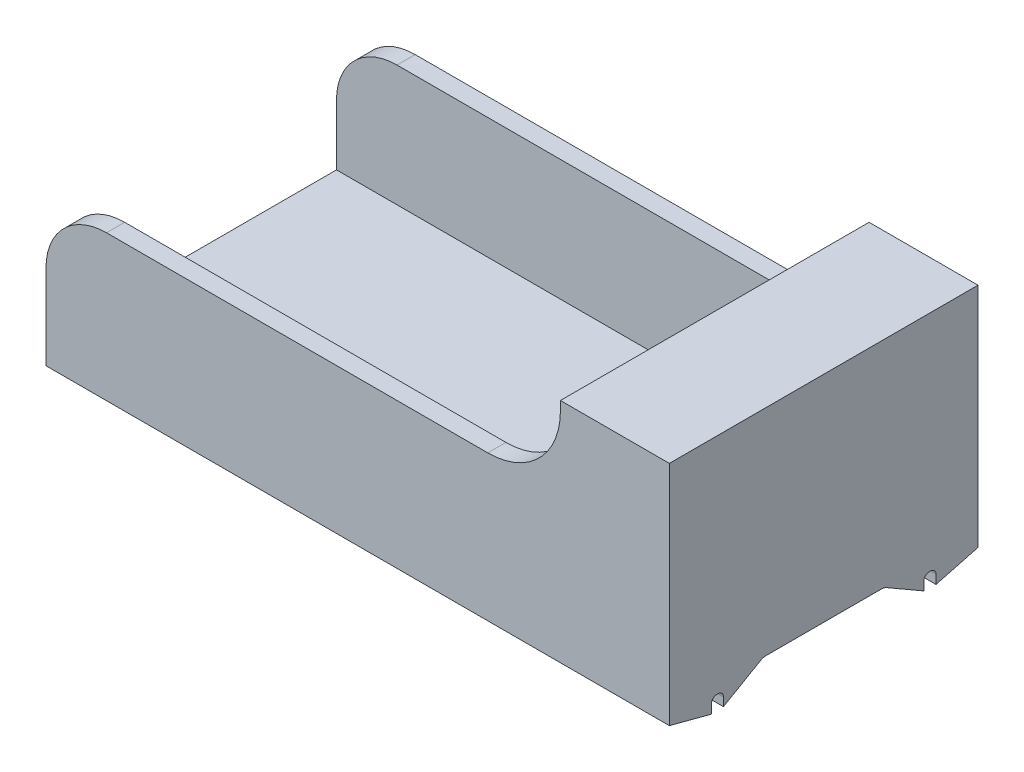
ISO-10303-21;
HEADER;
FILE_DESCRIPTION(('STEP AP214'),'2;1');
FILE_NAME('part.step','',(''),(''),'','','');
FILE_SCHEMA(('AUTOMOTIVE_DESIGN { 1 0 10303 214 1 1 1 1 }'));
ENDSEC;
DATA;
#1=APPLICATION_CONTEXT('core data for automotive mechanical design processes');
#2=APPLICATION_PROTOCOL_DEFINITION('international standard','automotive_design',2000,#1);
#3=PRODUCT_CONTEXT('',#1,'mechanical');
#4=PRODUCT('Part','Part','',(#3));
#5=PRODUCT_RELATED_PRODUCT_CATEGORY('part','',(#4));
#6=PRODUCT_DEFINITION_FORMATION('','',#4);
#7=PRODUCT_DEFINITION_CONTEXT('part definition',#1,'design');
#8=PRODUCT_DEFINITION('design','',#6,#7);
#9=PRODUCT_DEFINITION_SHAPE('','',#8);
#10=(LENGTH_UNIT() NAMED_UNIT(*) SI_UNIT(.MILLI.,.METRE.));
#11=(NAMED_UNIT(*) PLANE_ANGLE_UNIT() SI_UNIT($,.RADIAN.));
#12=(NAMED_UNIT(*) SI_UNIT($,.STERADIAN.) SOLID_ANGLE_UNIT());
#13=UNCERTAINTY_MEASURE_WITH_UNIT(LENGTH_MEASURE(1.E-05),#10,'distance_accuracy_value','');
#14=(GEOMETRIC_REPRESENTATION_CONTEXT(3) GLOBAL_UNCERTAINTY_ASSIGNED_CONTEXT((#13)) GLOBAL_UNIT_ASSIGNED_CONTEXT((#10,
#11,#12)) REPRESENTATION_CONTEXT('',''));
#15=CARTESIAN_POINT('',(0.,0.,0.));
#16=DIRECTION('',(0.,0.,1.));
#17=DIRECTION('',(1.,0.,0.));
#18=AXIS2_PLACEMENT_3D('',#15,#16,#17);
#19=CARTESIAN_POINT('',(0.,0.,0.));
#20=DIRECTION('',(0.,-1.,0.));
#21=DIRECTION('',(0.,0.,-1.));
#22=AXIS2_PLACEMENT_3D('',#19,#20,#21);
#23=PLANE('',#22);
#24=DIRECTION('',(0.,0.,1.));
#25=VECTOR('',#24,1.);
#26=CARTESIAN_POINT('',(0.,0.,0.));
#27=LINE('',#26,#25);
#28=CARTESIAN_POINT('',(0.,0.,-31.9641016151377));
#29=VERTEX_POINT('',#28);
#30=CARTESIAN_POINT('',(0.,0.,-13.0358983848622));
#31=VERTEX_POINT('',#30);
#32=EDGE_CURVE('E493',#29,#31,#27,.T.);
#33=ORIENTED_EDGE('',*,*,#32,.F.);
#34=DIRECTION('',(1.,0.,0.));
#35=VECTOR('',#34,1.);
#36=CARTESIAN_POINT('',(-10.,0.,-31.9641016151378));
#37=LINE('',#36,#35);
#38=CARTESIAN_POINT('',(103.,0.,-31.9641016151378));
#39=VERTEX_POINT('',#38);
#40=EDGE_CURVE('E386',#39,#29,#37,.F.);
#41=ORIENTED_EDGE('',*,*,#40,.F.);
#42=DIRECTION('',(0.,0.,1.));
#43=VECTOR('',#42,1.);
#44=CARTESIAN_POINT('',(103.,0.,-48.));
#45=LINE('',#44,#43);
#46=CARTESIAN_POINT('',(103.,0.,-13.0358983848623));
#47=VERTEX_POINT('',#46);
#48=EDGE_CURVE('E432',#39,#47,#45,.T.);
#49=ORIENTED_EDGE('',*,*,#48,.T.);
#50=DIRECTION('',(1.,0.,0.));
#51=VECTOR('',#50,1.);
#52=CARTESIAN_POINT('',(-10.,0.,-13.0358983848622));
#53=LINE('',#52,#51);
#54=EDGE_CURVE('E390',#31,#47,#53,.T.);
#55=ORIENTED_EDGE('',*,*,#54,.F.);
#56=EDGE_LOOP('',(#33,#41,#49,#55));
#57=FACE_BOUND('',#56,.T.);
#58=ADVANCED_FACE('F47',(#57),#23,.T.);
#59=CARTESIAN_POINT('',(100.,22.,-45.));
#60=DIRECTION('',(0.,1.,0.));
#61=DIRECTION('',(0.,0.,1.));
#62=AXIS2_PLACEMENT_3D('',#59,#60,#61);
#63=PLANE('',#62);
#64=DIRECTION('',(-1.,0.,0.));
#65=VECTOR('',#64,1.);
#66=CARTESIAN_POINT('',(100.,22.,-48.));
#67=LINE('',#66,#65);
#68=CARTESIAN_POINT('',(73.,22.,-48.));
#69=VERTEX_POINT('',#68);
#70=CARTESIAN_POINT('',(9.99999999999998,22.,-48.));
#71=VERTEX_POINT('',#70);
#72=EDGE_CURVE('E465',#69,#71,#67,.T.);
#73=ORIENTED_EDGE('',*,*,#72,.T.);
#74=DIRECTION('',(0.,0.,-1.));
#75=VECTOR('',#74,1.);
#76=CARTESIAN_POINT('',(9.99999999999999,22.,-45.));
#77=LINE('',#76,#75);
#78=CARTESIAN_POINT('',(9.99999999999998,22.,-45.));
#79=VERTEX_POINT('',#78);
#80=EDGE_CURVE('E607',#71,#79,#77,.F.);
#81=ORIENTED_EDGE('',*,*,#80,.T.);
#82=DIRECTION('',(-1.,0.,0.));
#83=VECTOR('',#82,1.);
#84=CARTESIAN_POINT('',(100.,22.,-45.));
#85=LINE('',#84,#83);
#86=CARTESIAN_POINT('',(73.,22.,-45.));
#87=VERTEX_POINT('',#86);
#88=EDGE_CURVE('E496',#87,#79,#85,.T.);
#89=ORIENTED_EDGE('',*,*,#88,.F.);
#90=DIRECTION('',(0.,0.,-1.));
#91=VECTOR('',#90,1.);
#92=CARTESIAN_POINT('',(73.,22.,-45.));
#93=LINE('',#92,#91);
#94=EDGE_CURVE('E570',#87,#69,#93,.T.);
#95=ORIENTED_EDGE('',*,*,#94,.T.);
#96=EDGE_LOOP('',(#73,#81,#89,#95));
#97=FACE_BOUND('',#96,.T.);
#98=ADVANCED_FACE('F630',(#97),#63,.T.);
#99=CARTESIAN_POINT('',(100.,22.,0.));
#100=DIRECTION('',(0.,1.,0.));
#101=DIRECTION('',(0.,0.,1.));
#102=AXIS2_PLACEMENT_3D('',#99,#100,#101);
#103=PLANE('',#102);
#104=DIRECTION('',(-1.,0.,0.));
#105=VECTOR('',#104,1.);
#106=CARTESIAN_POINT('',(100.,22.,0.));
#107=LINE('',#106,#105);
#108=CARTESIAN_POINT('',(73.,22.,0.));
#109=VERTEX_POINT('',#108);
#110=CARTESIAN_POINT('',(9.99999999999999,22.,0.));
#111=VERTEX_POINT('',#110);
#112=EDGE_CURVE('E490',#109,#111,#107,.T.);
#113=ORIENTED_EDGE('',*,*,#112,.T.);
#114=DIRECTION('',(0.,0.,-1.));
#115=VECTOR('',#114,1.);
#116=CARTESIAN_POINT('',(10.,22.,3.));
#117=LINE('',#116,#115);
#118=CARTESIAN_POINT('',(10.,22.,3.));
#119=VERTEX_POINT('',#118);
#120=EDGE_CURVE('E56',#111,#119,#117,.F.);
#121=ORIENTED_EDGE('',*,*,#120,.T.);
#122=DIRECTION('',(-1.,0.,0.));
#123=VECTOR('',#122,1.);
#124=CARTESIAN_POINT('',(100.,22.,2.99999999999997));
#125=LINE('',#124,#123);
#126=CARTESIAN_POINT('',(73.,22.,2.99999999999998));
#127=VERTEX_POINT('',#126);
#128=EDGE_CURVE('E481',#127,#119,#125,.T.);
#129=ORIENTED_EDGE('',*,*,#128,.F.);
#130=DIRECTION('',(0.,0.,-1.));
#131=VECTOR('',#130,1.);
#132=CARTESIAN_POINT('',(73.,22.,0.));
#133=LINE('',#132,#131);
#134=EDGE_CURVE('E580',#127,#109,#133,.T.);
#135=ORIENTED_EDGE('',*,*,#134,.T.);
#136=EDGE_LOOP('',(#113,#121,#129,#135));
#137=FACE_BOUND('',#136,.T.);
#138=ADVANCED_FACE('F722',(#137),#103,.T.);
#139=CARTESIAN_POINT('',(0.,2.,0.));
#140=DIRECTION('',(1.,0.,0.));
#141=DIRECTION('',(0.,0.,-1.));
#142=AXIS2_PLACEMENT_3D('',#139,#140,#141);
#143=PLANE('',#142);
#144=DIRECTION('',(0.,1.,0.));
#145=VECTOR('',#144,1.);
#146=CARTESIAN_POINT('',(0.,2.,-45.));
#147=LINE('',#146,#145);
#148=CARTESIAN_POINT('',(0.,2.,-45.));
#149=VERTEX_POINT('',#148);
#150=CARTESIAN_POINT('',(0.,12.,-45.));
#151=VERTEX_POINT('',#150);
#152=EDGE_CURVE('E487',#149,#151,#147,.T.);
#153=ORIENTED_EDGE('',*,*,#152,.T.);
#154=DIRECTION('',(0.,0.,-1.));
#155=VECTOR('',#154,1.);
#156=CARTESIAN_POINT('',(0.,12.,-48.));
#157=LINE('',#156,#155);
#158=CARTESIAN_POINT('',(0.,12.,-48.));
#159=VERTEX_POINT('',#158);
#160=EDGE_CURVE('E600',#151,#159,#157,.T.);
#161=ORIENTED_EDGE('',*,*,#160,.T.);
#162=DIRECTION('',(0.,-1.,0.));
#163=VECTOR('',#162,1.);
#164=CARTESIAN_POINT('',(0.,22.,-48.));
#165=LINE('',#164,#163);
#166=CARTESIAN_POINT('',(0.,-2.03421701422188,-48.));
#167=VERTEX_POINT('',#166);
#168=EDGE_CURVE('E504',#159,#167,#165,.T.);
#169=ORIENTED_EDGE('',*,*,#168,.T.);
#170=DIRECTION('',(0.,-0.254493299279644,0.967074537262646));
#171=VECTOR('',#170,1.);
#172=CARTESIAN_POINT('',(0.,-2.69275218169454,-45.4975663636038));
#173=LINE('',#172,#171);
#174=CARTESIAN_POINT('',(0.,-3.8604605341743,-41.0602746241807));
#175=VERTEX_POINT('',#174);
#176=EDGE_CURVE('E412',#167,#175,#173,.T.);
#177=ORIENTED_EDGE('',*,*,#176,.T.);
#178=DIRECTION('',(0.,-1.,0.));
#179=VECTOR('',#178,1.);
#180=CARTESIAN_POINT('',(0.,-3.8604605341743,-41.0602746241807));
#181=LINE('',#180,#179);
#182=CARTESIAN_POINT('',(0.,-2.38757632022863,-41.0602746241807));
#183=VERTEX_POINT('',#182);
#184=EDGE_CURVE('E276',#183,#175,#181,.T.);
#185=ORIENTED_EDGE('',*,*,#184,.F.);
#186=CARTESIAN_POINT('',(0.,-2.38757632022863,-40.1602746241807));
#187=DIRECTION('',(-1.,0.,0.));
#188=DIRECTION('',(0.,0.,-1.));
#189=AXIS2_PLACEMENT_3D('',#186,#187,#188);
#190=CIRCLE('',#189,0.899999999999999);
#191=CARTESIAN_POINT('',(0.,-1.48757632022863,-40.1602746241807));
#192=VERTEX_POINT('',#191);
#193=EDGE_CURVE('E296',#192,#183,#190,.T.);
#194=ORIENTED_EDGE('',*,*,#193,.F.);
#195=DIRECTION('',(0.,0.,-1.));
#196=VECTOR('',#195,1.);
#197=CARTESIAN_POINT('',(0.,-1.48757632022863,-39.9602746241807));
#198=LINE('',#197,#196);
#199=CARTESIAN_POINT('',(0.,-1.48757632022863,-39.9602746241807));
#200=VERTEX_POINT('',#199);
#201=EDGE_CURVE('E292',#200,#192,#198,.T.);
#202=ORIENTED_EDGE('',*,*,#201,.F.);
#203=CARTESIAN_POINT('',(0.,-2.38757632022863,-39.9602746241807));
#204=DIRECTION('',(-1.,0.,0.));
#205=DIRECTION('',(0.,0.,-1.));
#206=AXIS2_PLACEMENT_3D('',#203,#204,#205);
#207=CIRCLE('',#206,0.899999999999999);
#208=CARTESIAN_POINT('',(0.,-2.38757632022863,-39.0602746241807));
#209=VERTEX_POINT('',#208);
#210=EDGE_CURVE('E268',#209,#200,#207,.T.);
#211=ORIENTED_EDGE('',*,*,#210,.F.);
#212=DIRECTION('',(0.,1.,0.));
#213=VECTOR('',#212,1.);
#214=CARTESIAN_POINT('',(0.,-3.78757632022863,-39.0602746241807));
#215=LINE('',#214,#213);
#216=CARTESIAN_POINT('',(0.,-3.78757632022864,-39.0602746241807));
#217=VERTEX_POINT('',#216);
#218=EDGE_CURVE('E279',#217,#209,#215,.T.);
#219=ORIENTED_EDGE('',*,*,#218,.F.);
#220=DIRECTION('',(0.,-0.500000000000002,-0.866025403784438));
#221=VECTOR('',#220,1.);
#222=CARTESIAN_POINT('',(0.,-9.76219687932943,-49.4086209884888));
#223=LINE('',#222,#221);
#224=CARTESIAN_POINT('',(0.,-0.267949192431118,-32.9641016151378));
#225=VERTEX_POINT('',#224);
#226=EDGE_CURVE('E402',#225,#217,#223,.T.);
#227=ORIENTED_EDGE('',*,*,#226,.F.);
#228=CARTESIAN_POINT('',(0.,-1.99999999999999,-31.9641016151378));
#229=DIRECTION('',(1.,0.,0.));
#230=DIRECTION('',(0.,0.,-1.));
#231=AXIS2_PLACEMENT_3D('',#228,#229,#230);
#232=CIRCLE('',#231,2.);
#233=EDGE_CURVE('E416',#225,#29,#232,.T.);
#234=ORIENTED_EDGE('',*,*,#233,.T.);
#235=ORIENTED_EDGE('',*,*,#32,.T.);
#236=CARTESIAN_POINT('',(0.,-1.99999999999999,-13.0358983848622));
#237=DIRECTION('',(1.,0.,0.));
#238=DIRECTION('',(0.,0.,-1.));
#239=AXIS2_PLACEMENT_3D('',#236,#237,#238);
#240=CIRCLE('',#239,2.);
#241=CARTESIAN_POINT('',(0.,-0.267949192431113,-12.0358983848622));
#242=VERTEX_POINT('',#241);
#243=EDGE_CURVE('E408',#31,#242,#240,.T.);
#244=ORIENTED_EDGE('',*,*,#243,.T.);
#245=DIRECTION('',(0.,0.500000000000002,-0.866025403784438));
#246=VECTOR('',#245,1.);
#247=CARTESIAN_POINT('',(0.,12.3214509171738,-33.8413790115111));
#248=LINE('',#247,#246);
#249=CARTESIAN_POINT('',(0.,-3.78757632022865,-5.93972537581922));
#250=VERTEX_POINT('',#249);
#251=EDGE_CURVE('E407',#250,#242,#248,.T.);
#252=ORIENTED_EDGE('',*,*,#251,.F.);
#253=DIRECTION('',(0.,-1.,0.));
#254=VECTOR('',#253,1.);
#255=CARTESIAN_POINT('',(0.,-3.78757632022864,-5.93972537581922));
#256=LINE('',#255,#254);
#257=CARTESIAN_POINT('',(0.,-2.38757632022864,-5.93972537581922));
#258=VERTEX_POINT('',#257);
#259=EDGE_CURVE('E316',#258,#250,#256,.T.);
#260=ORIENTED_EDGE('',*,*,#259,.F.);
#261=CARTESIAN_POINT('',(0.,-2.38757632022864,-5.03972537581922));
#262=DIRECTION('',(-1.,0.,0.));
#263=DIRECTION('',(0.,0.,1.));
#264=AXIS2_PLACEMENT_3D('',#261,#262,#263);
#265=CIRCLE('',#264,0.9);
#266=CARTESIAN_POINT('',(0.,-1.48757632022864,-5.03972537581922));
#267=VERTEX_POINT('',#266);
#268=EDGE_CURVE('E328',#267,#258,#265,.T.);
#269=ORIENTED_EDGE('',*,*,#268,.F.);
#270=DIRECTION('',(0.,0.,-1.));
#271=VECTOR('',#270,1.);
#272=CARTESIAN_POINT('',(0.,-1.48757632022864,-5.03972537581922));
#273=LINE('',#272,#271);
#274=CARTESIAN_POINT('',(0.,-1.48757632022864,-4.83972537581922));
#275=VERTEX_POINT('',#274);
#276=EDGE_CURVE('E332',#275,#267,#273,.T.);
#277=ORIENTED_EDGE('',*,*,#276,.F.);
#278=CARTESIAN_POINT('',(0.,-2.38757632022864,-4.83972537581922));
#279=DIRECTION('',(-1.,0.,0.));
#280=DIRECTION('',(0.,0.,1.));
#281=AXIS2_PLACEMENT_3D('',#278,#279,#280);
#282=CIRCLE('',#281,0.9);
#283=CARTESIAN_POINT('',(0.,-2.38757632022864,-3.93972537581922));
#284=VERTEX_POINT('',#283);
#285=EDGE_CURVE('E336',#284,#275,#282,.T.);
#286=ORIENTED_EDGE('',*,*,#285,.F.);
#287=DIRECTION('',(0.,1.,0.));
#288=VECTOR('',#287,1.);
#289=CARTESIAN_POINT('',(0.,-2.38757632022864,-3.93972537581922));
#290=LINE('',#289,#288);
#291=CARTESIAN_POINT('',(0.,-3.86046053417434,-3.93972537581922));
#292=VERTEX_POINT('',#291);
#293=EDGE_CURVE('E286',#292,#284,#290,.T.);
#294=ORIENTED_EDGE('',*,*,#293,.F.);
#295=DIRECTION('',(0.,-0.254493299279644,-0.967074537262646));
#296=VECTOR('',#295,1.);
#297=CARTESIAN_POINT('',(0.,-15.2445656531972,-47.199324828106));
#298=LINE('',#297,#296);
#299=CARTESIAN_POINT('',(0.,-2.03421701422193,3.));
#300=VERTEX_POINT('',#299);
#301=EDGE_CURVE('E403',#300,#292,#298,.T.);
#302=ORIENTED_EDGE('',*,*,#301,.F.);
#303=DIRECTION('',(0.,1.,0.));
#304=VECTOR('',#303,1.);
#305=CARTESIAN_POINT('',(0.,22.,3.));
#306=LINE('',#305,#304);
#307=CARTESIAN_POINT('',(0.,12.,3.));
#308=VERTEX_POINT('',#307);
#309=EDGE_CURVE('E483',#300,#308,#306,.T.);
#310=ORIENTED_EDGE('',*,*,#309,.T.);
#311=DIRECTION('',(0.,0.,-1.));
#312=VECTOR('',#311,1.);
#313=CARTESIAN_POINT('',(0.,12.,0.));
#314=LINE('',#313,#312);
#315=CARTESIAN_POINT('',(0.,12.,0.));
#316=VERTEX_POINT('',#315);
#317=EDGE_CURVE('E596',#308,#316,#314,.T.);
#318=ORIENTED_EDGE('',*,*,#317,.T.);
#319=DIRECTION('',(0.,-1.,0.));
#320=VECTOR('',#319,1.);
#321=CARTESIAN_POINT('',(0.,2.,0.));
#322=LINE('',#321,#320);
#323=CARTESIAN_POINT('',(0.,2.,0.));
#324=VERTEX_POINT('',#323);
#325=EDGE_CURVE('E482',#316,#324,#322,.T.);
#326=ORIENTED_EDGE('',*,*,#325,.T.);
#327=DIRECTION('',(0.,0.,1.));
#328=VECTOR('',#327,1.);
#329=CARTESIAN_POINT('',(0.,2.,0.));
#330=LINE('',#329,#328);
#331=EDGE_CURVE('E524',#149,#324,#330,.T.);
#332=ORIENTED_EDGE('',*,*,#331,.F.);
#333=EDGE_LOOP('',(#153,#161,#169,#177,#185,#194,#202,#211,#219,#227,#234,#235,#244,#252,#260,
#269,#277,#286,#294,#302,#310,#318,#326,#332));
#334=FACE_BOUND('',#333,.T.);
#335=ADVANCED_FACE('F289',(#334),#143,.F.);
#336=CARTESIAN_POINT('',(0.,2.,0.));
#337=DIRECTION('',(0.,-1.,0.));
#338=DIRECTION('',(0.,0.,-1.));
#339=AXIS2_PLACEMENT_3D('',#336,#337,#338);
#340=PLANE('',#339);
#341=DIRECTION('',(1.,0.,0.));
#342=VECTOR('',#341,1.);
#343=CARTESIAN_POINT('',(100.,2.,0.));
#344=LINE('',#343,#342);
#345=CARTESIAN_POINT('',(100.,2.,0.));
#346=VERTEX_POINT('',#345);
#347=EDGE_CURVE('E512',#324,#346,#344,.T.);
#348=ORIENTED_EDGE('',*,*,#347,.T.);
#349=DIRECTION('',(0.,0.,-1.));
#350=VECTOR('',#349,1.);
#351=CARTESIAN_POINT('',(100.,2.,-45.));
#352=LINE('',#351,#350);
#353=CARTESIAN_POINT('',(100.,2.,-45.));
#354=VERTEX_POINT('',#353);
#355=EDGE_CURVE('E516',#346,#354,#352,.T.);
#356=ORIENTED_EDGE('',*,*,#355,.T.);
#357=DIRECTION('',(-1.,0.,0.));
#358=VECTOR('',#357,1.);
#359=CARTESIAN_POINT('',(0.,2.,-45.));
#360=LINE('',#359,#358);
#361=EDGE_CURVE('E520',#354,#149,#360,.T.);
#362=ORIENTED_EDGE('',*,*,#361,.T.);
#363=ORIENTED_EDGE('',*,*,#331,.T.);
#364=EDGE_LOOP('',(#348,#356,#362,#363));
#365=FACE_BOUND('',#364,.T.);
#366=ADVANCED_FACE('F742',(#365),#340,.F.);
#367=CARTESIAN_POINT('',(100.,2.,-45.));
#368=DIRECTION('',(0.,0.,1.));
#369=DIRECTION('',(1.,0.,0.));
#370=AXIS2_PLACEMENT_3D('',#367,#368,#369);
#371=PLANE('',#370);
#372=ORIENTED_EDGE('',*,*,#88,.T.);
#373=CARTESIAN_POINT('',(9.99999999999999,12.,-45.));
#374=DIRECTION('',(0.,0.,1.));
#375=DIRECTION('',(1.,0.,0.));
#376=AXIS2_PLACEMENT_3D('',#373,#374,#375);
#377=CIRCLE('',#376,10.);
#378=EDGE_CURVE('E610',#79,#151,#377,.T.);
#379=ORIENTED_EDGE('',*,*,#378,.T.);
#380=ORIENTED_EDGE('',*,*,#152,.F.);
#381=ORIENTED_EDGE('',*,*,#361,.F.);
#382=DIRECTION('',(0.,1.,0.));
#383=VECTOR('',#382,1.);
#384=CARTESIAN_POINT('',(100.,0.,-45.));
#385=LINE('',#384,#383);
#386=CARTESIAN_POINT('',(100.,32.5,-45.));
#387=VERTEX_POINT('',#386);
#388=EDGE_CURVE('E500',#354,#387,#385,.T.);
#389=ORIENTED_EDGE('',*,*,#388,.T.);
#390=DIRECTION('',(1.,0.,0.));
#391=VECTOR('',#390,1.);
#392=CARTESIAN_POINT('',(85.,32.5,-45.));
#393=LINE('',#392,#391);
#394=CARTESIAN_POINT('',(87.,32.5,-45.));
#395=VERTEX_POINT('',#394);
#396=EDGE_CURVE('E470',#395,#387,#393,.T.);
#397=ORIENTED_EDGE('',*,*,#396,.F.);
#398=DIRECTION('',(-0.707106781186543,0.707106781186552,0.));
#399=VECTOR('',#398,1.);
#400=CARTESIAN_POINT('',(87.,32.5,-45.));
#401=LINE('',#400,#399);
#402=CARTESIAN_POINT('',(85.,34.5,-45.));
#403=VERTEX_POINT('',#402);
#404=EDGE_CURVE('E539',#395,#403,#401,.T.);
#405=ORIENTED_EDGE('',*,*,#404,.T.);
#406=DIRECTION('',(0.,-1.,0.));
#407=VECTOR('',#406,1.);
#408=CARTESIAN_POINT('',(85.,22.,-45.));
#409=LINE('',#408,#407);
#410=CARTESIAN_POINT('',(85.,34.,-45.));
#411=VERTEX_POINT('',#410);
#412=EDGE_CURVE('E443',#403,#411,#409,.T.);
#413=ORIENTED_EDGE('',*,*,#412,.T.);
#414=CARTESIAN_POINT('',(73.,34.,-45.));
#415=DIRECTION('',(0.,0.,1.));
#416=DIRECTION('',(1.,0.,0.));
#417=AXIS2_PLACEMENT_3D('',#414,#415,#416);
#418=CIRCLE('',#417,12.);
#419=EDGE_CURVE('E587',#411,#87,#418,.F.);
#420=ORIENTED_EDGE('',*,*,#419,.T.);
#421=EDGE_LOOP('',(#372,#379,#380,#381,#389,#397,#405,#413,#420));
#422=FACE_BOUND('',#421,.T.);
#423=ADVANCED_FACE('F617',(#422),#371,.T.);
#424=CARTESIAN_POINT('',(100.,22.,-48.));
#425=DIRECTION('',(0.,0.,-1.));
#426=DIRECTION('',(-1.,0.,0.));
#427=AXIS2_PLACEMENT_3D('',#424,#425,#426);
#428=PLANE('',#427);
#429=ORIENTED_EDGE('',*,*,#168,.F.);
#430=CARTESIAN_POINT('',(9.99999999999998,12.,-48.));
#431=DIRECTION('',(0.,0.,-1.));
#432=DIRECTION('',(-1.,0.,0.));
#433=AXIS2_PLACEMENT_3D('',#430,#431,#432);
#434=CIRCLE('',#433,10.);
#435=EDGE_CURVE('E604',#159,#71,#434,.T.);
#436=ORIENTED_EDGE('',*,*,#435,.T.);
#437=ORIENTED_EDGE('',*,*,#72,.F.);
#438=CARTESIAN_POINT('',(73.,34.,-48.));
#439=DIRECTION('',(0.,0.,-1.));
#440=DIRECTION('',(-1.,0.,0.));
#441=AXIS2_PLACEMENT_3D('',#438,#439,#440);
#442=CIRCLE('',#441,12.);
#443=CARTESIAN_POINT('',(85.,34.,-48.));
#444=VERTEX_POINT('',#443);
#445=EDGE_CURVE('E584',#69,#444,#442,.F.);
#446=ORIENTED_EDGE('',*,*,#445,.T.);
#447=DIRECTION('',(0.,1.,0.));
#448=VECTOR('',#447,1.);
#449=CARTESIAN_POINT('',(85.,22.,-48.));
#450=LINE('',#449,#448);
#451=CARTESIAN_POINT('',(85.,35.5,-48.));
#452=VERTEX_POINT('',#451);
#453=EDGE_CURVE('E447',#444,#452,#450,.T.);
#454=ORIENTED_EDGE('',*,*,#453,.T.);
#455=DIRECTION('',(1.,0.,0.));
#456=VECTOR('',#455,1.);
#457=CARTESIAN_POINT('',(85.,35.5,-48.));
#458=LINE('',#457,#456);
#459=CARTESIAN_POINT('',(103.,35.5,-48.));
#460=VERTEX_POINT('',#459);
#461=EDGE_CURVE('E466',#452,#460,#458,.T.);
#462=ORIENTED_EDGE('',*,*,#461,.T.);
#463=DIRECTION('',(0.,1.,0.));
#464=VECTOR('',#463,1.);
#465=CARTESIAN_POINT('',(103.,35.5,-48.));
#466=LINE('',#465,#464);
#467=CARTESIAN_POINT('',(103.,-2.0342170142219,-48.));
#468=VERTEX_POINT('',#467);
#469=EDGE_CURVE('E429',#468,#460,#466,.T.);
#470=ORIENTED_EDGE('',*,*,#469,.F.);
#471=DIRECTION('',(-1.,0.,0.));
#472=VECTOR('',#471,1.);
#473=CARTESIAN_POINT('',(103.,-2.0342170142219,-48.));
#474=LINE('',#473,#472);
#475=EDGE_CURVE('E374',#468,#167,#474,.T.);
#476=ORIENTED_EDGE('',*,*,#475,.T.);
#477=EDGE_LOOP('',(#429,#436,#437,#446,#454,#462,#470,#476));
#478=FACE_BOUND('',#477,.T.);
#479=ADVANCED_FACE('F628',(#478),#428,.T.);
#480=CARTESIAN_POINT('',(100.,2.,0.));
#481=DIRECTION('',(0.,0.,-1.));
#482=DIRECTION('',(-1.,0.,0.));
#483=AXIS2_PLACEMENT_3D('',#480,#481,#482);
#484=PLANE('',#483);
#485=ORIENTED_EDGE('',*,*,#325,.F.);
#486=CARTESIAN_POINT('',(10.,12.,0.));
#487=DIRECTION('',(0.,0.,-1.));
#488=DIRECTION('',(-1.,0.,0.));
#489=AXIS2_PLACEMENT_3D('',#486,#487,#488);
#490=CIRCLE('',#489,10.);
#491=EDGE_CURVE('E70',#316,#111,#490,.T.);
#492=ORIENTED_EDGE('',*,*,#491,.T.);
#493=ORIENTED_EDGE('',*,*,#112,.F.);
#494=CARTESIAN_POINT('',(73.,34.,0.));
#495=DIRECTION('',(0.,0.,-1.));
#496=DIRECTION('',(-1.,0.,0.));
#497=AXIS2_PLACEMENT_3D('',#494,#495,#496);
#498=CIRCLE('',#497,12.);
#499=CARTESIAN_POINT('',(85.,34.,0.));
#500=VERTEX_POINT('',#499);
#501=EDGE_CURVE('E590',#109,#500,#498,.F.);
#502=ORIENTED_EDGE('',*,*,#501,.T.);
#503=DIRECTION('',(0.,1.,0.));
#504=VECTOR('',#503,1.);
#505=CARTESIAN_POINT('',(85.,22.,0.));
#506=LINE('',#505,#504);
#507=CARTESIAN_POINT('',(85.,34.5,0.));
#508=VERTEX_POINT('',#507);
#509=EDGE_CURVE('E440',#500,#508,#506,.T.);
#510=ORIENTED_EDGE('',*,*,#509,.T.);
#511=DIRECTION('',(0.707106781186543,-0.707106781186552,0.));
#512=VECTOR('',#511,1.);
#513=CARTESIAN_POINT('',(87.,32.5,0.));
#514=LINE('',#513,#512);
#515=CARTESIAN_POINT('',(87.,32.5,0.));
#516=VERTEX_POINT('',#515);
#517=EDGE_CURVE('E543',#508,#516,#514,.T.);
#518=ORIENTED_EDGE('',*,*,#517,.T.);
#519=DIRECTION('',(1.,0.,0.));
#520=VECTOR('',#519,1.);
#521=CARTESIAN_POINT('',(85.,32.5,0.));
#522=LINE('',#521,#520);
#523=CARTESIAN_POINT('',(100.,32.5,0.));
#524=VERTEX_POINT('',#523);
#525=EDGE_CURVE('E458',#516,#524,#522,.T.);
#526=ORIENTED_EDGE('',*,*,#525,.T.);
#527=DIRECTION('',(0.,-1.,0.));
#528=VECTOR('',#527,1.);
#529=CARTESIAN_POINT('',(100.,0.,0.));
#530=LINE('',#529,#528);
#531=EDGE_CURVE('E477',#524,#346,#530,.T.);
#532=ORIENTED_EDGE('',*,*,#531,.T.);
#533=ORIENTED_EDGE('',*,*,#347,.F.);
#534=EDGE_LOOP('',(#485,#492,#493,#502,#510,#518,#526,#532,#533));
#535=FACE_BOUND('',#534,.T.);
#536=ADVANCED_FACE('F727',(#535),#484,.T.);
#537=CARTESIAN_POINT('',(100.,22.,2.99999999999997));
#538=DIRECTION('',(0.,0.,1.));
#539=DIRECTION('',(1.,0.,0.));
#540=AXIS2_PLACEMENT_3D('',#537,#538,#539);
#541=PLANE('',#540);
#542=ORIENTED_EDGE('',*,*,#128,.T.);
#543=CARTESIAN_POINT('',(10.,12.,3.));
#544=DIRECTION('',(0.,0.,1.));
#545=DIRECTION('',(1.,0.,0.));
#546=AXIS2_PLACEMENT_3D('',#543,#544,#545);
#547=CIRCLE('',#546,10.);
#548=EDGE_CURVE('E11',#119,#308,#547,.T.);
#549=ORIENTED_EDGE('',*,*,#548,.T.);
#550=ORIENTED_EDGE('',*,*,#309,.F.);
#551=DIRECTION('',(-1.,0.,0.));
#552=VECTOR('',#551,1.);
#553=CARTESIAN_POINT('',(0.,-2.03421701422192,3.));
#554=LINE('',#553,#552);
#555=CARTESIAN_POINT('',(103.,-2.03421701422193,3.));
#556=VERTEX_POINT('',#555);
#557=EDGE_CURVE('E355',#556,#300,#554,.T.);
#558=ORIENTED_EDGE('',*,*,#557,.F.);
#559=DIRECTION('',(0.,1.,0.));
#560=VECTOR('',#559,1.);
#561=CARTESIAN_POINT('',(103.,35.5,3.));
#562=LINE('',#561,#560);
#563=CARTESIAN_POINT('',(103.,35.5,3.));
#564=VERTEX_POINT('',#563);
#565=EDGE_CURVE('E381',#556,#564,#562,.T.);
#566=ORIENTED_EDGE('',*,*,#565,.T.);
#567=DIRECTION('',(1.,0.,0.));
#568=VECTOR('',#567,1.);
#569=CARTESIAN_POINT('',(85.,35.5,2.99999999999997));
#570=LINE('',#569,#568);
#571=CARTESIAN_POINT('',(85.,35.5,2.99999999999997));
#572=VERTEX_POINT('',#571);
#573=EDGE_CURVE('E461',#572,#564,#570,.T.);
#574=ORIENTED_EDGE('',*,*,#573,.F.);
#575=DIRECTION('',(0.,-1.,0.));
#576=VECTOR('',#575,1.);
#577=CARTESIAN_POINT('',(85.,22.,2.99999999999997));
#578=LINE('',#577,#576);
#579=CARTESIAN_POINT('',(85.,34.,2.99999999999997));
#580=VERTEX_POINT('',#579);
#581=EDGE_CURVE('E454',#572,#580,#578,.T.);
#582=ORIENTED_EDGE('',*,*,#581,.T.);
#583=CARTESIAN_POINT('',(73.,34.,2.99999999999998));
#584=DIRECTION('',(0.,0.,1.));
#585=DIRECTION('',(1.,0.,0.));
#586=AXIS2_PLACEMENT_3D('',#583,#584,#585);
#587=CIRCLE('',#586,12.);
#588=EDGE_CURVE('E593',#580,#127,#587,.F.);
#589=ORIENTED_EDGE('',*,*,#588,.T.);
#590=EDGE_LOOP('',(#542,#549,#550,#558,#566,#574,#582,#589));
#591=FACE_BOUND('',#590,.T.);
#592=ADVANCED_FACE('F716',(#591),#541,.T.);
#593=CARTESIAN_POINT('',(85.,35.5,-48.));
#594=DIRECTION('',(0.,1.,0.));
#595=DIRECTION('',(0.,0.,1.));
#596=AXIS2_PLACEMENT_3D('',#593,#594,#595);
#597=PLANE('',#596);
#598=ORIENTED_EDGE('',*,*,#573,.T.);
#599=DIRECTION('',(0.,0.,1.));
#600=VECTOR('',#599,1.);
#601=CARTESIAN_POINT('',(103.,35.5,-48.));
#602=LINE('',#601,#600);
#603=EDGE_CURVE('E433',#460,#564,#602,.T.);
#604=ORIENTED_EDGE('',*,*,#603,.F.);
#605=ORIENTED_EDGE('',*,*,#461,.F.);
#606=DIRECTION('',(0.,0.,1.));
#607=VECTOR('',#606,1.);
#608=CARTESIAN_POINT('',(85.,35.5,-48.));
#609=LINE('',#608,#607);
#610=EDGE_CURVE('E450',#452,#572,#609,.T.);
#611=ORIENTED_EDGE('',*,*,#610,.T.);
#612=EDGE_LOOP('',(#598,#604,#605,#611));
#613=FACE_BOUND('',#612,.T.);
#614=ADVANCED_FACE('F643',(#613),#597,.T.);
#615=CARTESIAN_POINT('',(85.,32.5,-45.));
#616=DIRECTION('',(0.,-1.,0.));
#617=DIRECTION('',(0.,0.,-1.));
#618=AXIS2_PLACEMENT_3D('',#615,#616,#617);
#619=PLANE('',#618);
#620=ORIENTED_EDGE('',*,*,#525,.F.);
#621=DIRECTION('',(0.,0.,-1.));
#622=VECTOR('',#621,1.);
#623=CARTESIAN_POINT('',(87.,32.5,-45.));
#624=LINE('',#623,#622);
#625=EDGE_CURVE('E528',#516,#395,#624,.T.);
#626=ORIENTED_EDGE('',*,*,#625,.T.);
#627=ORIENTED_EDGE('',*,*,#396,.T.);
#628=DIRECTION('',(0.,0.,-1.));
#629=VECTOR('',#628,1.);
#630=CARTESIAN_POINT('',(100.,32.5,-45.));
#631=LINE('',#630,#629);
#632=EDGE_CURVE('E437',#524,#387,#631,.T.);
#633=ORIENTED_EDGE('',*,*,#632,.F.);
#634=EDGE_LOOP('',(#620,#626,#627,#633));
#635=FACE_BOUND('',#634,.T.);
#636=ADVANCED_FACE('F736',(#635),#619,.T.);
#637=CARTESIAN_POINT('',(85.,0.,0.));
#638=DIRECTION('',(1.,0.,0.));
#639=DIRECTION('',(0.,0.,-1.));
#640=AXIS2_PLACEMENT_3D('',#637,#638,#639);
#641=PLANE('',#640);
#642=ORIENTED_EDGE('',*,*,#453,.F.);
#643=DIRECTION('',(0.,0.,-1.));
#644=VECTOR('',#643,1.);
#645=CARTESIAN_POINT('',(85.,34.,0.));
#646=LINE('',#645,#644);
#647=EDGE_CURVE('E577',#444,#411,#646,.F.);
#648=ORIENTED_EDGE('',*,*,#647,.T.);
#649=ORIENTED_EDGE('',*,*,#412,.F.);
#650=DIRECTION('',(0.,0.,1.));
#651=VECTOR('',#650,1.);
#652=CARTESIAN_POINT('',(85.,34.5,0.));
#653=LINE('',#652,#651);
#654=EDGE_CURVE('E535',#403,#508,#653,.T.);
#655=ORIENTED_EDGE('',*,*,#654,.T.);
#656=ORIENTED_EDGE('',*,*,#509,.F.);
#657=DIRECTION('',(0.,0.,-1.));
#658=VECTOR('',#657,1.);
#659=CARTESIAN_POINT('',(85.,34.,0.));
#660=LINE('',#659,#658);
#661=EDGE_CURVE('E574',#500,#580,#660,.F.);
#662=ORIENTED_EDGE('',*,*,#661,.T.);
#663=ORIENTED_EDGE('',*,*,#581,.F.);
#664=ORIENTED_EDGE('',*,*,#610,.F.);
#665=EDGE_LOOP('',(#642,#648,#649,#655,#656,#662,#663,#664));
#666=FACE_BOUND('',#665,.T.);
#667=ADVANCED_FACE('F640',(#666),#641,.F.);
#668=CARTESIAN_POINT('',(87.,32.5,-45.));
#669=DIRECTION('',(-0.707106781186552,-0.707106781186543,0.));
#670=DIRECTION('',(0.,0.,1.));
#671=AXIS2_PLACEMENT_3D('',#668,#669,#670);
#672=PLANE('',#671);
#673=ORIENTED_EDGE('',*,*,#517,.F.);
#674=ORIENTED_EDGE('',*,*,#654,.F.);
#675=ORIENTED_EDGE('',*,*,#404,.F.);
#676=ORIENTED_EDGE('',*,*,#625,.F.);
#677=EDGE_LOOP('',(#673,#674,#675,#676));
#678=FACE_BOUND('',#677,.T.);
#679=ADVANCED_FACE('F732',(#678),#672,.T.);
#680=CARTESIAN_POINT('',(100.,35.5,-48.));
#681=DIRECTION('',(-1.,0.,0.));
#682=DIRECTION('',(0.,0.,1.));
#683=AXIS2_PLACEMENT_3D('',#680,#681,#682);
#684=PLANE('',#683);
#685=ORIENTED_EDGE('',*,*,#531,.F.);
#686=ORIENTED_EDGE('',*,*,#632,.T.);
#687=ORIENTED_EDGE('',*,*,#388,.F.);
#688=ORIENTED_EDGE('',*,*,#355,.F.);
#689=EDGE_LOOP('',(#685,#686,#687,#688));
#690=FACE_BOUND('',#689,.T.);
#691=ADVANCED_FACE('F739',(#690),#684,.T.);
#692=CARTESIAN_POINT('',(103.,35.5,-48.));
#693=DIRECTION('',(1.,0.,0.));
#694=DIRECTION('',(0.,0.,-1.));
#695=AXIS2_PLACEMENT_3D('',#692,#693,#694);
#696=PLANE('',#695);
#697=DIRECTION('',(0.,1.,0.));
#698=VECTOR('',#697,1.);
#699=CARTESIAN_POINT('',(103.,35.5,-41.0602746241808));
#700=LINE('',#699,#698);
#701=CARTESIAN_POINT('',(103.,-3.86046053417433,-41.0602746241808));
#702=VERTEX_POINT('',#701);
#703=CARTESIAN_POINT('',(103.,-2.38757632022863,-41.0602746241808));
#704=VERTEX_POINT('',#703);
#705=EDGE_CURVE('E345',#702,#704,#700,.T.);
#706=ORIENTED_EDGE('',*,*,#705,.F.);
#707=DIRECTION('',(0.,0.254493299279644,-0.967074537262646));
#708=VECTOR('',#707,1.);
#709=CARTESIAN_POINT('',(103.,-15.2445656531972,2.19932482810601));
#710=LINE('',#709,#708);
#711=EDGE_CURVE('E354',#702,#468,#710,.T.);
#712=ORIENTED_EDGE('',*,*,#711,.T.);
#713=ORIENTED_EDGE('',*,*,#469,.T.);
#714=ORIENTED_EDGE('',*,*,#603,.T.);
#715=ORIENTED_EDGE('',*,*,#565,.F.);
#716=DIRECTION('',(0.,0.254493299279644,0.967074537262646));
#717=VECTOR('',#716,1.);
#718=CARTESIAN_POINT('',(103.,-2.69275218169461,0.497566363603844));
#719=LINE('',#718,#717);
#720=CARTESIAN_POINT('',(103.,-3.86046053417437,-3.93972537581923));
#721=VERTEX_POINT('',#720);
#722=EDGE_CURVE('E378',#721,#556,#719,.T.);
#723=ORIENTED_EDGE('',*,*,#722,.F.);
#724=DIRECTION('',(0.,-1.,0.));
#725=VECTOR('',#724,1.);
#726=CARTESIAN_POINT('',(103.,35.5,-3.9397253758193));
#727=LINE('',#726,#725);
#728=CARTESIAN_POINT('',(103.,-2.38757632022864,-3.93972537581925));
#729=VERTEX_POINT('',#728);
#730=EDGE_CURVE('E348',#729,#721,#727,.T.);
#731=ORIENTED_EDGE('',*,*,#730,.F.);
#732=CARTESIAN_POINT('',(103.,-2.38757632022864,-4.83972537581925));
#733=DIRECTION('',(1.,0.,0.));
#734=DIRECTION('',(0.,0.,-1.));
#735=AXIS2_PLACEMENT_3D('',#732,#733,#734);
#736=CIRCLE('',#735,0.9);
#737=CARTESIAN_POINT('',(103.,-1.48757632022864,-4.83972537581925));
#738=VERTEX_POINT('',#737);
#739=EDGE_CURVE('E553',#738,#729,#736,.T.);
#740=ORIENTED_EDGE('',*,*,#739,.F.);
#741=DIRECTION('',(0.,0.,1.));
#742=VECTOR('',#741,1.);
#743=CARTESIAN_POINT('',(103.,-1.48757632022869,-48.));
#744=LINE('',#743,#742);
#745=CARTESIAN_POINT('',(103.,-1.48757632022864,-5.03972537581925));
#746=VERTEX_POINT('',#745);
#747=EDGE_CURVE('E556',#746,#738,#744,.T.);
#748=ORIENTED_EDGE('',*,*,#747,.F.);
#749=CARTESIAN_POINT('',(103.,-2.38757632022864,-5.03972537581925));
#750=DIRECTION('',(1.,0.,0.));
#751=DIRECTION('',(0.,0.,-1.));
#752=AXIS2_PLACEMENT_3D('',#749,#750,#751);
#753=CIRCLE('',#752,0.9);
#754=CARTESIAN_POINT('',(103.,-2.38757632022864,-5.93972537581925));
#755=VERTEX_POINT('',#754);
#756=EDGE_CURVE('E559',#755,#746,#753,.T.);
#757=ORIENTED_EDGE('',*,*,#756,.F.);
#758=DIRECTION('',(0.,1.,0.));
#759=VECTOR('',#758,1.);
#760=CARTESIAN_POINT('',(103.,35.5,-5.93972537581925));
#761=LINE('',#760,#759);
#762=CARTESIAN_POINT('',(103.,-3.78757632022867,-5.93972537581925));
#763=VERTEX_POINT('',#762);
#764=EDGE_CURVE('E351',#763,#755,#761,.T.);
#765=ORIENTED_EDGE('',*,*,#764,.F.);
#766=DIRECTION('',(0.,-0.500000000000002,0.866025403784438));
#767=VECTOR('',#766,1.);
#768=CARTESIAN_POINT('',(103.,-9.76219687932945,4.40862098848883));
#769=LINE('',#768,#767);
#770=CARTESIAN_POINT('',(103.,-0.267949192431146,-12.0358983848622));
#771=VERTEX_POINT('',#770);
#772=EDGE_CURVE('E366',#771,#763,#769,.T.);
#773=ORIENTED_EDGE('',*,*,#772,.F.);
#774=CARTESIAN_POINT('',(103.,-2.00000000000002,-13.0358983848623));
#775=DIRECTION('',(-1.,0.,0.));
#776=DIRECTION('',(0.,0.,1.));
#777=AXIS2_PLACEMENT_3D('',#774,#775,#776);
#778=CIRCLE('',#777,2.);
#779=EDGE_CURVE('E370',#771,#47,#778,.T.);
#780=ORIENTED_EDGE('',*,*,#779,.T.);
#781=ORIENTED_EDGE('',*,*,#48,.F.);
#782=CARTESIAN_POINT('',(103.,-2.00000000000002,-31.9641016151378));
#783=DIRECTION('',(-1.,0.,0.));
#784=DIRECTION('',(0.,0.,1.));
#785=AXIS2_PLACEMENT_3D('',#782,#783,#784);
#786=CIRCLE('',#785,2.);
#787=CARTESIAN_POINT('',(103.,-0.26794919243114,-32.9641016151378));
#788=VERTEX_POINT('',#787);
#789=EDGE_CURVE('E363',#39,#788,#786,.T.);
#790=ORIENTED_EDGE('',*,*,#789,.T.);
#791=DIRECTION('',(0.,0.500000000000002,0.866025403784438));
#792=VECTOR('',#791,1.);
#793=CARTESIAN_POINT('',(103.,12.3214509171738,-11.1586209884889));
#794=LINE('',#793,#792);
#795=CARTESIAN_POINT('',(103.,-3.78757632022864,-39.0602746241807));
#796=VERTEX_POINT('',#795);
#797=EDGE_CURVE('E360',#796,#788,#794,.T.);
#798=ORIENTED_EDGE('',*,*,#797,.F.);
#799=DIRECTION('',(0.,-1.,0.));
#800=VECTOR('',#799,1.);
#801=CARTESIAN_POINT('',(103.,35.5,-39.0602746241808));
#802=LINE('',#801,#800);
#803=CARTESIAN_POINT('',(103.,-2.38757632022863,-39.0602746241808));
#804=VERTEX_POINT('',#803);
#805=EDGE_CURVE('E307',#804,#796,#802,.T.);
#806=ORIENTED_EDGE('',*,*,#805,.F.);
#807=CARTESIAN_POINT('',(103.,-2.38757632022863,-39.9602746241808));
#808=DIRECTION('',(1.,0.,0.));
#809=DIRECTION('',(0.,0.,-1.));
#810=AXIS2_PLACEMENT_3D('',#807,#808,#809);
#811=CIRCLE('',#810,0.899999999999999);
#812=CARTESIAN_POINT('',(103.,-1.48757632022863,-39.9602746241808));
#813=VERTEX_POINT('',#812);
#814=EDGE_CURVE('E271',#813,#804,#811,.T.);
#815=ORIENTED_EDGE('',*,*,#814,.F.);
#816=DIRECTION('',(0.,0.,1.));
#817=VECTOR('',#816,1.);
#818=CARTESIAN_POINT('',(103.,-1.48757632022862,-48.));
#819=LINE('',#818,#817);
#820=CARTESIAN_POINT('',(103.,-1.48757632022863,-40.1602746241808));
#821=VERTEX_POINT('',#820);
#822=EDGE_CURVE('E564',#821,#813,#819,.T.);
#823=ORIENTED_EDGE('',*,*,#822,.F.);
#824=CARTESIAN_POINT('',(103.,-2.38757632022863,-40.1602746241808));
#825=DIRECTION('',(1.,0.,0.));
#826=DIRECTION('',(0.,0.,-1.));
#827=AXIS2_PLACEMENT_3D('',#824,#825,#826);
#828=CIRCLE('',#827,0.899999999999999);
#829=EDGE_CURVE('E567',#704,#821,#828,.T.);
#830=ORIENTED_EDGE('',*,*,#829,.F.);
#831=EDGE_LOOP('',(#706,#712,#713,#714,#715,#723,#731,#740,#748,#757,#765,#773,#780,#781,#790,
#798,#806,#815,#823,#830));
#832=FACE_BOUND('',#831,.T.);
#833=ADVANCED_FACE('F664',(#832),#696,.T.);
#834=CARTESIAN_POINT('',(-10.,0.,-12.5));
#835=DIRECTION('',(0.,-0.866025403784438,-0.500000000000002));
#836=DIRECTION('',(0.,-0.500000000000002,0.866025403784438));
#837=AXIS2_PLACEMENT_3D('',#834,#835,#836);
#838=PLANE('',#837);
#839=ORIENTED_EDGE('',*,*,#251,.T.);
#840=DIRECTION('',(1.,0.,0.));
#841=VECTOR('',#840,1.);
#842=CARTESIAN_POINT('',(-10.,-0.267949192431116,-12.0358983848622));
#843=LINE('',#842,#841);
#844=EDGE_CURVE('E394',#771,#242,#843,.F.);
#845=ORIENTED_EDGE('',*,*,#844,.F.);
#846=ORIENTED_EDGE('',*,*,#772,.T.);
#847=DIRECTION('',(1.,0.,0.));
#848=VECTOR('',#847,1.);
#849=CARTESIAN_POINT('',(140.,-3.78757632022868,-5.93972537581925));
#850=LINE('',#849,#848);
#851=EDGE_CURVE('E359',#250,#763,#850,.T.);
#852=ORIENTED_EDGE('',*,*,#851,.F.);
#853=EDGE_LOOP('',(#839,#845,#846,#852));
#854=FACE_BOUND('',#853,.T.);
#855=ADVANCED_FACE('F683',(#854),#838,.T.);
#856=CARTESIAN_POINT('',(-10.,-1.99999999999999,-13.0358983848622));
#857=DIRECTION('',(1.,0.,0.));
#858=DIRECTION('',(0.,1.,0.));
#859=AXIS2_PLACEMENT_3D('',#856,#857,#858);
#860=CYLINDRICAL_SURFACE('',#859,2.);
#861=ORIENTED_EDGE('',*,*,#54,.T.);
#862=ORIENTED_EDGE('',*,*,#779,.F.);
#863=ORIENTED_EDGE('',*,*,#844,.T.);
#864=ORIENTED_EDGE('',*,*,#243,.F.);
#865=EDGE_LOOP('',(#861,#862,#863,#864));
#866=FACE_BOUND('',#865,.T.);
#867=ADVANCED_FACE('F678',(#866),#860,.F.);
#868=CARTESIAN_POINT('',(-9.99999999999998,12.0636495090608,56.5718927884744));
#869=DIRECTION('',(0.,-0.967074537262647,0.254493299279644));
#870=DIRECTION('',(0.,0.254493299279644,0.967074537262647));
#871=AXIS2_PLACEMENT_3D('',#868,#869,#870);
#872=PLANE('',#871);
#873=DIRECTION('',(-1.,0.,0.));
#874=VECTOR('',#873,1.);
#875=CARTESIAN_POINT('',(-10.,-3.86046053417434,-3.93972537581921));
#876=LINE('',#875,#874);
#877=EDGE_CURVE('E550',#721,#292,#876,.T.);
#878=ORIENTED_EDGE('',*,*,#877,.F.);
#879=ORIENTED_EDGE('',*,*,#722,.T.);
#880=ORIENTED_EDGE('',*,*,#557,.T.);
#881=ORIENTED_EDGE('',*,*,#301,.T.);
#882=EDGE_LOOP('',(#878,#879,#880,#881));
#883=FACE_BOUND('',#882,.T.);
#884=ADVANCED_FACE('F712',(#883),#872,.T.);
#885=CARTESIAN_POINT('',(-10.,12.0636495090608,-101.571892788474));
#886=DIRECTION('',(0.,0.967074537262647,0.254493299279644));
#887=DIRECTION('',(0.,0.254493299279644,-0.967074537262647));
#888=AXIS2_PLACEMENT_3D('',#885,#886,#887);
#889=PLANE('',#888);
#890=ORIENTED_EDGE('',*,*,#711,.F.);
#891=DIRECTION('',(-1.,0.,0.));
#892=VECTOR('',#891,1.);
#893=CARTESIAN_POINT('',(-10.,-3.8604605341743,-41.0602746241807));
#894=LINE('',#893,#892);
#895=EDGE_CURVE('E546',#702,#175,#894,.T.);
#896=ORIENTED_EDGE('',*,*,#895,.T.);
#897=ORIENTED_EDGE('',*,*,#176,.F.);
#898=ORIENTED_EDGE('',*,*,#475,.F.);
#899=EDGE_LOOP('',(#890,#896,#897,#898));
#900=FACE_BOUND('',#899,.T.);
#901=ADVANCED_FACE('F651',(#900),#889,.F.);
#902=CARTESIAN_POINT('',(-10.,0.,-32.5));
#903=DIRECTION('',(0.,-0.866025403784438,0.500000000000002));
#904=DIRECTION('',(0.,0.500000000000002,0.866025403784438));
#905=AXIS2_PLACEMENT_3D('',#902,#903,#904);
#906=PLANE('',#905);
#907=ORIENTED_EDGE('',*,*,#226,.T.);
#908=DIRECTION('',(1.,0.,0.));
#909=VECTOR('',#908,1.);
#910=CARTESIAN_POINT('',(-10.,-3.78757632022861,-39.0602746241807));
#911=LINE('',#910,#909);
#912=EDGE_CURVE('E282',#796,#217,#911,.F.);
#913=ORIENTED_EDGE('',*,*,#912,.F.);
#914=ORIENTED_EDGE('',*,*,#797,.T.);
#915=DIRECTION('',(1.,0.,0.));
#916=VECTOR('',#915,1.);
#917=CARTESIAN_POINT('',(-10.,-0.267949192431116,-32.9641016151378));
#918=LINE('',#917,#916);
#919=EDGE_CURVE('E382',#225,#788,#918,.T.);
#920=ORIENTED_EDGE('',*,*,#919,.F.);
#921=EDGE_LOOP('',(#907,#913,#914,#920));
#922=FACE_BOUND('',#921,.T.);
#923=ADVANCED_FACE('F669',(#922),#906,.T.);
#924=CARTESIAN_POINT('',(-10.,-1.99999999999999,-31.9641016151378));
#925=DIRECTION('',(1.,0.,0.));
#926=DIRECTION('',(0.,1.,0.));
#927=AXIS2_PLACEMENT_3D('',#924,#925,#926);
#928=CYLINDRICAL_SURFACE('',#927,2.);
#929=ORIENTED_EDGE('',*,*,#919,.T.);
#930=ORIENTED_EDGE('',*,*,#789,.F.);
#931=ORIENTED_EDGE('',*,*,#40,.T.);
#932=ORIENTED_EDGE('',*,*,#233,.F.);
#933=EDGE_LOOP('',(#929,#930,#931,#932));
#934=FACE_BOUND('',#933,.T.);
#935=ADVANCED_FACE('F672',(#934),#928,.F.);
#936=CARTESIAN_POINT('',(108.,-3.8604605341743,-41.0602746241808));
#937=DIRECTION('',(0.,0.,-1.));
#938=DIRECTION('',(-1.,0.,0.));
#939=AXIS2_PLACEMENT_3D('',#936,#937,#938);
#940=PLANE('',#939);
#941=ORIENTED_EDGE('',*,*,#705,.T.);
#942=DIRECTION('',(-1.,0.,0.));
#943=VECTOR('',#942,1.);
#944=CARTESIAN_POINT('',(108.,-2.38757632022863,-41.0602746241808));
#945=LINE('',#944,#943);
#946=EDGE_CURVE('E304',#704,#183,#945,.T.);
#947=ORIENTED_EDGE('',*,*,#946,.T.);
#948=ORIENTED_EDGE('',*,*,#184,.T.);
#949=ORIENTED_EDGE('',*,*,#895,.F.);
#950=EDGE_LOOP('',(#941,#947,#948,#949));
#951=FACE_BOUND('',#950,.T.);
#952=ADVANCED_FACE('F654',(#951),#940,.F.);
#953=CARTESIAN_POINT('',(108.,-2.38757632022863,-40.1602746241808));
#954=DIRECTION('',(-1.,0.,0.));
#955=DIRECTION('',(0.,0.,1.));
#956=AXIS2_PLACEMENT_3D('',#953,#954,#955);
#957=CYLINDRICAL_SURFACE('',#956,0.899999999999999);
#958=ORIENTED_EDGE('',*,*,#829,.T.);
#959=DIRECTION('',(-1.,0.,0.));
#960=VECTOR('',#959,1.);
#961=CARTESIAN_POINT('',(108.,-1.48757632022863,-40.1602746241808));
#962=LINE('',#961,#960);
#963=EDGE_CURVE('E308',#821,#192,#962,.T.);
#964=ORIENTED_EDGE('',*,*,#963,.T.);
#965=ORIENTED_EDGE('',*,*,#193,.T.);
#966=ORIENTED_EDGE('',*,*,#946,.F.);
#967=EDGE_LOOP('',(#958,#964,#965,#966));
#968=FACE_BOUND('',#967,.T.);
#969=ADVANCED_FACE('F659',(#968),#957,.F.);
#970=CARTESIAN_POINT('',(108.,-1.48757632022863,-39.9602746241808));
#971=DIRECTION('',(0.,1.,0.));
#972=DIRECTION('',(0.,0.,1.));
#973=AXIS2_PLACEMENT_3D('',#970,#971,#972);
#974=PLANE('',#973);
#975=ORIENTED_EDGE('',*,*,#822,.T.);
#976=DIRECTION('',(-1.,0.,0.));
#977=VECTOR('',#976,1.);
#978=CARTESIAN_POINT('',(108.,-1.48757632022863,-39.9602746241808));
#979=LINE('',#978,#977);
#980=EDGE_CURVE('E275',#813,#200,#979,.T.);
#981=ORIENTED_EDGE('',*,*,#980,.T.);
#982=ORIENTED_EDGE('',*,*,#201,.T.);
#983=ORIENTED_EDGE('',*,*,#963,.F.);
#984=EDGE_LOOP('',(#975,#981,#982,#983));
#985=FACE_BOUND('',#984,.T.);
#986=ADVANCED_FACE('F663',(#985),#974,.F.);
#987=CARTESIAN_POINT('',(108.,-2.38757632022863,-39.9602746241808));
#988=DIRECTION('',(-1.,0.,0.));
#989=DIRECTION('',(0.,0.,1.));
#990=AXIS2_PLACEMENT_3D('',#987,#988,#989);
#991=CYLINDRICAL_SURFACE('',#990,0.899999999999999);
#992=ORIENTED_EDGE('',*,*,#814,.T.);
#993=DIRECTION('',(-1.,0.,0.));
#994=VECTOR('',#993,1.);
#995=CARTESIAN_POINT('',(108.,-2.38757632022863,-39.0602746241808));
#996=LINE('',#995,#994);
#997=EDGE_CURVE('E263',#804,#209,#996,.T.);
#998=ORIENTED_EDGE('',*,*,#997,.T.);
#999=ORIENTED_EDGE('',*,*,#210,.T.);
#1000=ORIENTED_EDGE('',*,*,#980,.F.);
#1001=EDGE_LOOP('',(#992,#998,#999,#1000));
#1002=FACE_BOUND('',#1001,.T.);
#1003=ADVANCED_FACE('F265',(#1002),#991,.F.);
#1004=CARTESIAN_POINT('',(108.,-3.78757632022863,-39.0602746241808));
#1005=DIRECTION('',(0.,0.,1.));
#1006=DIRECTION('',(1.,0.,0.));
#1007=AXIS2_PLACEMENT_3D('',#1004,#1005,#1006);
#1008=PLANE('',#1007);
#1009=ORIENTED_EDGE('',*,*,#805,.T.);
#1010=ORIENTED_EDGE('',*,*,#912,.T.);
#1011=ORIENTED_EDGE('',*,*,#218,.T.);
#1012=ORIENTED_EDGE('',*,*,#997,.F.);
#1013=EDGE_LOOP('',(#1009,#1010,#1011,#1012));
#1014=FACE_BOUND('',#1013,.T.);
#1015=ADVANCED_FACE('F280',(#1014),#1008,.F.);
#1016=CARTESIAN_POINT('',(108.,-3.78757632022864,-5.93972537581925));
#1017=DIRECTION('',(0.,0.,-1.));
#1018=DIRECTION('',(-1.,0.,0.));
#1019=AXIS2_PLACEMENT_3D('',#1016,#1017,#1018);
#1020=PLANE('',#1019);
#1021=ORIENTED_EDGE('',*,*,#764,.T.);
#1022=DIRECTION('',(-1.,0.,0.));
#1023=VECTOR('',#1022,1.);
#1024=CARTESIAN_POINT('',(108.,-2.38757632022864,-5.93972537581925));
#1025=LINE('',#1024,#1023);
#1026=EDGE_CURVE('E323',#755,#258,#1025,.T.);
#1027=ORIENTED_EDGE('',*,*,#1026,.T.);
#1028=ORIENTED_EDGE('',*,*,#259,.T.);
#1029=ORIENTED_EDGE('',*,*,#851,.T.);
#1030=EDGE_LOOP('',(#1021,#1027,#1028,#1029));
#1031=FACE_BOUND('',#1030,.T.);
#1032=ADVANCED_FACE('F688',(#1031),#1020,.F.);
#1033=CARTESIAN_POINT('',(108.,-2.38757632022864,-5.03972537581925));
#1034=DIRECTION('',(-1.,0.,0.));
#1035=DIRECTION('',(0.,0.,1.));
#1036=AXIS2_PLACEMENT_3D('',#1033,#1034,#1035);
#1037=CYLINDRICAL_SURFACE('',#1036,0.9);
#1038=ORIENTED_EDGE('',*,*,#756,.T.);
#1039=DIRECTION('',(-1.,0.,0.));
#1040=VECTOR('',#1039,1.);
#1041=CARTESIAN_POINT('',(108.,-1.48757632022864,-5.03972537581925));
#1042=LINE('',#1041,#1040);
#1043=EDGE_CURVE('E320',#746,#267,#1042,.T.);
#1044=ORIENTED_EDGE('',*,*,#1043,.T.);
#1045=ORIENTED_EDGE('',*,*,#268,.T.);
#1046=ORIENTED_EDGE('',*,*,#1026,.F.);
#1047=EDGE_LOOP('',(#1038,#1044,#1045,#1046));
#1048=FACE_BOUND('',#1047,.T.);
#1049=ADVANCED_FACE('F693',(#1048),#1037,.F.);
#1050=CARTESIAN_POINT('',(108.,-1.48757632022864,-5.03972537581925));
#1051=DIRECTION('',(0.,1.,0.));
#1052=DIRECTION('',(0.,0.,1.));
#1053=AXIS2_PLACEMENT_3D('',#1050,#1051,#1052);
#1054=PLANE('',#1053);
#1055=ORIENTED_EDGE('',*,*,#747,.T.);
#1056=DIRECTION('',(-1.,0.,0.));
#1057=VECTOR('',#1056,1.);
#1058=CARTESIAN_POINT('',(108.,-1.48757632022864,-4.83972537581925));
#1059=LINE('',#1058,#1057);
#1060=EDGE_CURVE('E317',#738,#275,#1059,.T.);
#1061=ORIENTED_EDGE('',*,*,#1060,.T.);
#1062=ORIENTED_EDGE('',*,*,#276,.T.);
#1063=ORIENTED_EDGE('',*,*,#1043,.F.);
#1064=EDGE_LOOP('',(#1055,#1061,#1062,#1063));
#1065=FACE_BOUND('',#1064,.T.);
#1066=ADVANCED_FACE('F697',(#1065),#1054,.F.);
#1067=CARTESIAN_POINT('',(108.,-2.38757632022864,-4.83972537581925));
#1068=DIRECTION('',(-1.,0.,0.));
#1069=DIRECTION('',(0.,0.,1.));
#1070=AXIS2_PLACEMENT_3D('',#1067,#1068,#1069);
#1071=CYLINDRICAL_SURFACE('',#1070,0.9);
#1072=ORIENTED_EDGE('',*,*,#739,.T.);
#1073=DIRECTION('',(-1.,0.,0.));
#1074=VECTOR('',#1073,1.);
#1075=CARTESIAN_POINT('',(108.,-2.38757632022864,-3.93972537581925));
#1076=LINE('',#1075,#1074);
#1077=EDGE_CURVE('E313',#729,#284,#1076,.T.);
#1078=ORIENTED_EDGE('',*,*,#1077,.T.);
#1079=ORIENTED_EDGE('',*,*,#285,.T.);
#1080=ORIENTED_EDGE('',*,*,#1060,.F.);
#1081=EDGE_LOOP('',(#1072,#1078,#1079,#1080));
#1082=FACE_BOUND('',#1081,.T.);
#1083=ADVANCED_FACE('F703',(#1082),#1071,.F.);
#1084=CARTESIAN_POINT('',(108.,-2.38757632022864,-3.93972537581925));
#1085=DIRECTION('',(0.,0.,1.));
#1086=DIRECTION('',(0.,-1.,0.));
#1087=AXIS2_PLACEMENT_3D('',#1084,#1085,#1086);
#1088=PLANE('',#1087);
#1089=ORIENTED_EDGE('',*,*,#730,.T.);
#1090=ORIENTED_EDGE('',*,*,#877,.T.);
#1091=ORIENTED_EDGE('',*,*,#293,.T.);
#1092=ORIENTED_EDGE('',*,*,#1077,.F.);
#1093=EDGE_LOOP('',(#1089,#1090,#1091,#1092));
#1094=FACE_BOUND('',#1093,.T.);
#1095=ADVANCED_FACE('F708',(#1094),#1088,.F.);
#1096=CARTESIAN_POINT('',(73.,34.,-45.));
#1097=DIRECTION('',(0.,0.,-1.));
#1098=DIRECTION('',(-1.,0.,0.));
#1099=AXIS2_PLACEMENT_3D('',#1096,#1097,#1098);
#1100=CYLINDRICAL_SURFACE('',#1099,12.);
#1101=ORIENTED_EDGE('',*,*,#419,.F.);
#1102=ORIENTED_EDGE('',*,*,#647,.F.);
#1103=ORIENTED_EDGE('',*,*,#445,.F.);
#1104=ORIENTED_EDGE('',*,*,#94,.F.);
#1105=EDGE_LOOP('',(#1101,#1102,#1103,#1104));
#1106=FACE_BOUND('',#1105,.T.);
#1107=ADVANCED_FACE('F634',(#1106),#1100,.F.);
#1108=CARTESIAN_POINT('',(73.,34.,0.));
#1109=DIRECTION('',(0.,0.,-1.));
#1110=DIRECTION('',(-1.,0.,0.));
#1111=AXIS2_PLACEMENT_3D('',#1108,#1109,#1110);
#1112=CYLINDRICAL_SURFACE('',#1111,12.);
#1113=ORIENTED_EDGE('',*,*,#588,.F.);
#1114=ORIENTED_EDGE('',*,*,#661,.F.);
#1115=ORIENTED_EDGE('',*,*,#501,.F.);
#1116=ORIENTED_EDGE('',*,*,#134,.F.);
#1117=EDGE_LOOP('',(#1113,#1114,#1115,#1116));
#1118=FACE_BOUND('',#1117,.T.);
#1119=ADVANCED_FACE('F724',(#1118),#1112,.F.);
#1120=CARTESIAN_POINT('',(10.,12.,0.));
#1121=DIRECTION('',(0.,0.,1.));
#1122=DIRECTION('',(1.,0.,0.));
#1123=AXIS2_PLACEMENT_3D('',#1120,#1121,#1122);
#1124=CYLINDRICAL_SURFACE('',#1123,10.);
#1125=ORIENTED_EDGE('',*,*,#378,.F.);
#1126=ORIENTED_EDGE('',*,*,#80,.F.);
#1127=ORIENTED_EDGE('',*,*,#435,.F.);
#1128=ORIENTED_EDGE('',*,*,#160,.F.);
#1129=EDGE_LOOP('',(#1125,#1126,#1127,#1128));
#1130=FACE_BOUND('',#1129,.T.);
#1131=ADVANCED_FACE('F625',(#1130),#1124,.T.);
#1132=CARTESIAN_POINT('',(10.,12.,0.));
#1133=DIRECTION('',(0.,0.,1.));
#1134=DIRECTION('',(1.,0.,0.));
#1135=AXIS2_PLACEMENT_3D('',#1132,#1133,#1134);
#1136=CYLINDRICAL_SURFACE('',#1135,10.);
#1137=ORIENTED_EDGE('',*,*,#548,.F.);
#1138=ORIENTED_EDGE('',*,*,#120,.F.);
#1139=ORIENTED_EDGE('',*,*,#491,.F.);
#1140=ORIENTED_EDGE('',*,*,#317,.F.);
#1141=EDGE_LOOP('',(#1137,#1138,#1139,#1140));
#1142=FACE_BOUND('',#1141,.T.);
#1143=ADVANCED_FACE('F49',(#1142),#1136,.T.);
#1144=CLOSED_SHELL('',(#58,#98,#138,#335,#366,#423,#479,#536,#592,#614,#636,#667,#679,#691,#833,
#855,#867,#884,#901,#923,#935,#952,#969,#986,#1003,#1015,#1032,#1049,#1066,#1083,#1095,#1107,
#1119,#1131,#1143));
#1145=MANIFOLD_SOLID_BREP('B2',#1144);
#1146=ADVANCED_BREP_SHAPE_REPRESENTATION('',(#18,#1145),#14);
#1147=SHAPE_DEFINITION_REPRESENTATION(#9,#1146);
ENDSEC;
END-ISO-10303-21;
